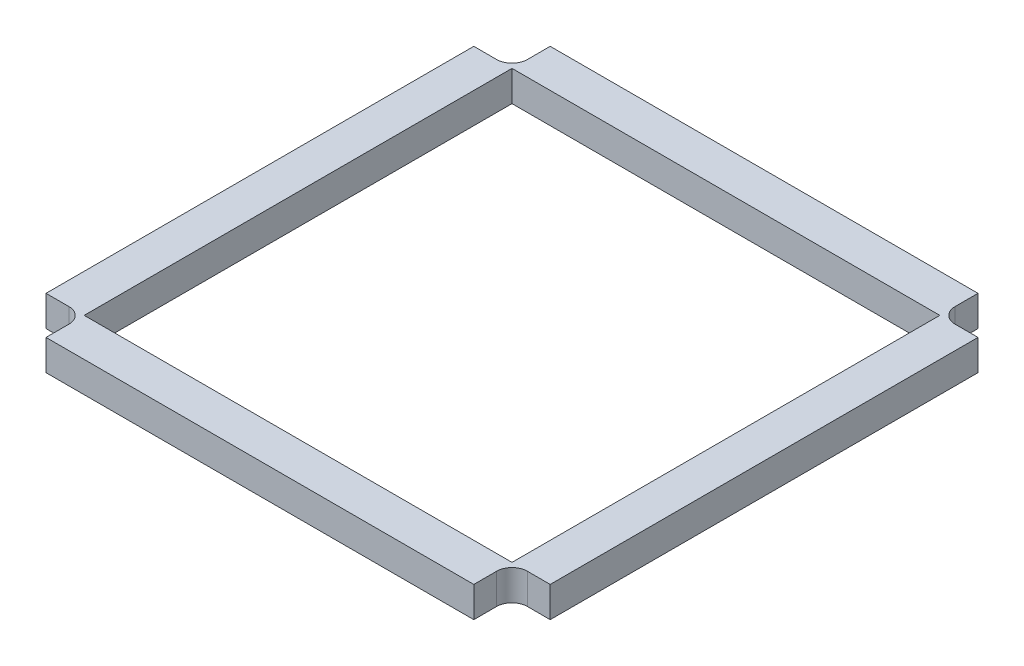
ISO-10303-21;
HEADER;
FILE_DESCRIPTION(('STEP AP214'),'2;1');
FILE_NAME('part.step','',(''),(''),'','','');
FILE_SCHEMA(('AUTOMOTIVE_DESIGN { 1 0 10303 214 1 1 1 1 }'));
ENDSEC;
DATA;
#1=APPLICATION_CONTEXT('core data for automotive mechanical design processes');
#2=APPLICATION_PROTOCOL_DEFINITION('international standard','automotive_design',2000,#1);
#3=PRODUCT_CONTEXT('',#1,'mechanical');
#4=PRODUCT('Part','Part','',(#3));
#5=PRODUCT_RELATED_PRODUCT_CATEGORY('part','',(#4));
#6=PRODUCT_DEFINITION_FORMATION('','',#4);
#7=PRODUCT_DEFINITION_CONTEXT('part definition',#1,'design');
#8=PRODUCT_DEFINITION('design','',#6,#7);
#9=PRODUCT_DEFINITION_SHAPE('','',#8);
#10=(LENGTH_UNIT() NAMED_UNIT(*) SI_UNIT(.MILLI.,.METRE.));
#11=(NAMED_UNIT(*) PLANE_ANGLE_UNIT() SI_UNIT($,.RADIAN.));
#12=(NAMED_UNIT(*) SI_UNIT($,.STERADIAN.) SOLID_ANGLE_UNIT());
#13=UNCERTAINTY_MEASURE_WITH_UNIT(LENGTH_MEASURE(1.E-05),#10,'distance_accuracy_value','');
#14=(GEOMETRIC_REPRESENTATION_CONTEXT(3) GLOBAL_UNCERTAINTY_ASSIGNED_CONTEXT((#13)) GLOBAL_UNIT_ASSIGNED_CONTEXT((#10,
#11,#12)) REPRESENTATION_CONTEXT('',''));
#15=CARTESIAN_POINT('',(0.,0.,0.));
#16=DIRECTION('',(0.,0.,1.));
#17=DIRECTION('',(1.,0.,0.));
#18=AXIS2_PLACEMENT_3D('',#15,#16,#17);
#19=CARTESIAN_POINT('',(0.,10.,0.));
#20=DIRECTION('',(0.,-1.,0.));
#21=DIRECTION('',(0.,0.,-1.));
#22=AXIS2_PLACEMENT_3D('',#19,#20,#21);
#23=PLANE('',#22);
#24=DIRECTION('',(0.,0.,1.));
#25=VECTOR('',#24,1.);
#26=CARTESIAN_POINT('',(0.,10.,0.));
#27=LINE('',#26,#25);
#28=CARTESIAN_POINT('',(0.,10.,-140.));
#29=VERTEX_POINT('',#28);
#30=CARTESIAN_POINT('',(0.,10.,0.));
#31=VERTEX_POINT('',#30);
#32=EDGE_CURVE('E275',#29,#31,#27,.T.);
#33=ORIENTED_EDGE('',*,*,#32,.F.);
#34=DIRECTION('',(-1.,0.,0.));
#35=VECTOR('',#34,1.);
#36=CARTESIAN_POINT('',(0.,10.,-140.));
#37=LINE('',#36,#35);
#38=CARTESIAN_POINT('',(140.,10.,-140.));
#39=VERTEX_POINT('',#38);
#40=EDGE_CURVE('E283',#39,#29,#37,.T.);
#41=ORIENTED_EDGE('',*,*,#40,.F.);
#42=DIRECTION('',(0.,0.,-1.));
#43=VECTOR('',#42,1.);
#44=CARTESIAN_POINT('',(140.,10.,0.));
#45=LINE('',#44,#43);
#46=CARTESIAN_POINT('',(140.,10.,0.));
#47=VERTEX_POINT('',#46);
#48=EDGE_CURVE('E280',#47,#39,#45,.T.);
#49=ORIENTED_EDGE('',*,*,#48,.F.);
#50=DIRECTION('',(1.,0.,0.));
#51=VECTOR('',#50,1.);
#52=CARTESIAN_POINT('',(0.,10.,0.));
#53=LINE('',#52,#51);
#54=EDGE_CURVE('E277',#31,#47,#53,.T.);
#55=ORIENTED_EDGE('',*,*,#54,.F.);
#56=EDGE_LOOP('',(#33,#41,#49,#55));
#57=FACE_BOUND('',#56,.T.);
#58=DIRECTION('',(0.,0.,-1.));
#59=VECTOR('',#58,1.);
#60=CARTESIAN_POINT('',(140.,10.,-145.000000000002));
#61=LINE('',#60,#59);
#62=CARTESIAN_POINT('',(140.,10.,-145.000000000002));
#63=VERTEX_POINT('',#62);
#64=CARTESIAN_POINT('',(140.,10.,-152.500000000002));
#65=VERTEX_POINT('',#64);
#66=EDGE_CURVE('E240',#63,#65,#61,.T.);
#67=ORIENTED_EDGE('',*,*,#66,.T.);
#68=DIRECTION('',(-1.,0.,0.));
#69=VECTOR('',#68,1.);
#70=CARTESIAN_POINT('',(-12.5,10.,-152.5));
#71=LINE('',#70,#69);
#72=CARTESIAN_POINT('',(0.,10.,-152.5));
#73=VERTEX_POINT('',#72);
#74=EDGE_CURVE('E11',#65,#73,#71,.T.);
#75=ORIENTED_EDGE('',*,*,#74,.T.);
#76=DIRECTION('',(0.,0.,-1.));
#77=VECTOR('',#76,1.);
#78=CARTESIAN_POINT('',(0.,10.,-145.));
#79=LINE('',#78,#77);
#80=CARTESIAN_POINT('',(0.,10.,-145.));
#81=VERTEX_POINT('',#80);
#82=EDGE_CURVE('E196',#81,#73,#79,.T.);
#83=ORIENTED_EDGE('',*,*,#82,.F.);
#84=CARTESIAN_POINT('',(-4.99999999999996,10.,-145.));
#85=DIRECTION('',(0.,1.,0.));
#86=DIRECTION('',(0.,0.,1.));
#87=AXIS2_PLACEMENT_3D('',#84,#85,#86);
#88=CIRCLE('',#87,5.);
#89=CARTESIAN_POINT('',(-4.99999999999996,10.,-140.));
#90=VERTEX_POINT('',#89);
#91=EDGE_CURVE('E256',#90,#81,#88,.T.);
#92=ORIENTED_EDGE('',*,*,#91,.F.);
#93=DIRECTION('',(-1.,0.,0.));
#94=VECTOR('',#93,1.);
#95=CARTESIAN_POINT('',(-4.99999999999996,10.,-140.));
#96=LINE('',#95,#94);
#97=CARTESIAN_POINT('',(-12.5,10.,-140.));
#98=VERTEX_POINT('',#97);
#99=EDGE_CURVE('E193',#90,#98,#96,.T.);
#100=ORIENTED_EDGE('',*,*,#99,.T.);
#101=DIRECTION('',(0.,0.,1.));
#102=VECTOR('',#101,1.);
#103=CARTESIAN_POINT('',(-12.5,10.,12.5));
#104=LINE('',#103,#102);
#105=CARTESIAN_POINT('',(-12.4999999999987,10.,-9.17421519602636E-13));
#106=VERTEX_POINT('',#105);
#107=EDGE_CURVE('E306',#98,#106,#104,.T.);
#108=ORIENTED_EDGE('',*,*,#107,.T.);
#109=DIRECTION('',(-1.,0.,0.));
#110=VECTOR('',#109,1.);
#111=CARTESIAN_POINT('',(-4.99999999999867,10.,-8.80416143237298E-13));
#112=LINE('',#111,#110);
#113=CARTESIAN_POINT('',(-4.99999999999867,10.,-8.80416143237298E-13));
#114=VERTEX_POINT('',#113);
#115=EDGE_CURVE('E189',#114,#106,#112,.T.);
#116=ORIENTED_EDGE('',*,*,#115,.F.);
#117=CARTESIAN_POINT('',(-4.99999999999873,10.,4.99999999999912));
#118=DIRECTION('',(0.,1.,0.));
#119=DIRECTION('',(0.,0.,1.));
#120=AXIS2_PLACEMENT_3D('',#117,#118,#119);
#121=CIRCLE('',#120,5.);
#122=CARTESIAN_POINT('',(1.27675647831893E-12,10.,4.99999999999917));
#123=VERTEX_POINT('',#122);
#124=EDGE_CURVE('E176',#123,#114,#121,.T.);
#125=ORIENTED_EDGE('',*,*,#124,.F.);
#126=DIRECTION('',(0.,0.,1.));
#127=VECTOR('',#126,1.);
#128=CARTESIAN_POINT('',(1.27675647831893E-12,10.,4.99999999999917));
#129=LINE('',#128,#127);
#130=CARTESIAN_POINT('',(1.13797860024079E-12,10.,12.4999999999992));
#131=VERTEX_POINT('',#130);
#132=EDGE_CURVE('E184',#123,#131,#129,.T.);
#133=ORIENTED_EDGE('',*,*,#132,.T.);
#134=DIRECTION('',(1.,0.,0.));
#135=VECTOR('',#134,1.);
#136=CARTESIAN_POINT('',(-12.5,10.,12.5));
#137=LINE('',#136,#135);
#138=CARTESIAN_POINT('',(140.,10.,12.5));
#139=VERTEX_POINT('',#138);
#140=EDGE_CURVE('E308',#131,#139,#137,.T.);
#141=ORIENTED_EDGE('',*,*,#140,.T.);
#142=DIRECTION('',(0.,0.,1.));
#143=VECTOR('',#142,1.);
#144=CARTESIAN_POINT('',(140.,10.,4.99999999999995));
#145=LINE('',#144,#143);
#146=CARTESIAN_POINT('',(140.,10.,4.99999999999995));
#147=VERTEX_POINT('',#146);
#148=EDGE_CURVE('E219',#147,#139,#145,.T.);
#149=ORIENTED_EDGE('',*,*,#148,.F.);
#150=CARTESIAN_POINT('',(145.,10.,4.99999999999995));
#151=DIRECTION('',(0.,1.,0.));
#152=DIRECTION('',(0.,0.,1.));
#153=AXIS2_PLACEMENT_3D('',#150,#151,#152);
#154=CIRCLE('',#153,5.);
#155=CARTESIAN_POINT('',(145.,10.,0.));
#156=VERTEX_POINT('',#155);
#157=EDGE_CURVE('E181',#156,#147,#154,.T.);
#158=ORIENTED_EDGE('',*,*,#157,.F.);
#159=DIRECTION('',(1.,0.,0.));
#160=VECTOR('',#159,1.);
#161=CARTESIAN_POINT('',(145.,10.,0.));
#162=LINE('',#161,#160);
#163=CARTESIAN_POINT('',(152.5,10.,0.));
#164=VERTEX_POINT('',#163);
#165=EDGE_CURVE('E216',#156,#164,#162,.T.);
#166=ORIENTED_EDGE('',*,*,#165,.T.);
#167=DIRECTION('',(0.,0.,-1.));
#168=VECTOR('',#167,1.);
#169=CARTESIAN_POINT('',(152.5,10.,12.5));
#170=LINE('',#169,#168);
#171=CARTESIAN_POINT('',(152.5,10.,-140.000000000002));
#172=VERTEX_POINT('',#171);
#173=EDGE_CURVE('E42',#164,#172,#170,.T.);
#174=ORIENTED_EDGE('',*,*,#173,.T.);
#175=DIRECTION('',(1.,0.,0.));
#176=VECTOR('',#175,1.);
#177=CARTESIAN_POINT('',(145.,10.,-140.000000000002));
#178=LINE('',#177,#176);
#179=CARTESIAN_POINT('',(145.,10.,-140.000000000002));
#180=VERTEX_POINT('',#179);
#181=EDGE_CURVE('E242',#180,#172,#178,.T.);
#182=ORIENTED_EDGE('',*,*,#181,.F.);
#183=CARTESIAN_POINT('',(145.,10.,-145.000000000002));
#184=DIRECTION('',(0.,1.,0.));
#185=DIRECTION('',(0.,0.,1.));
#186=AXIS2_PLACEMENT_3D('',#183,#184,#185);
#187=CIRCLE('',#186,5.);
#188=EDGE_CURVE('E215',#63,#180,#187,.T.);
#189=ORIENTED_EDGE('',*,*,#188,.F.);
#190=EDGE_LOOP('',(#67,#75,#83,#92,#100,#108,#116,#125,#133,#141,#149,#158,#166,#174,#182,#189));
#191=FACE_BOUND('',#190,.T.);
#192=ADVANCED_FACE('F33',(#57,#191),#23,.F.);
#193=CARTESIAN_POINT('',(0.,0.,0.));
#194=DIRECTION('',(0.,-1.,0.));
#195=DIRECTION('',(0.,0.,-1.));
#196=AXIS2_PLACEMENT_3D('',#193,#194,#195);
#197=PLANE('',#196);
#198=DIRECTION('',(-1.,0.,0.));
#199=VECTOR('',#198,1.);
#200=CARTESIAN_POINT('',(0.,0.,-140.));
#201=LINE('',#200,#199);
#202=CARTESIAN_POINT('',(140.,0.,-140.));
#203=VERTEX_POINT('',#202);
#204=CARTESIAN_POINT('',(0.,0.,-140.));
#205=VERTEX_POINT('',#204);
#206=EDGE_CURVE('E278',#203,#205,#201,.T.);
#207=ORIENTED_EDGE('',*,*,#206,.T.);
#208=DIRECTION('',(0.,0.,1.));
#209=VECTOR('',#208,1.);
#210=CARTESIAN_POINT('',(0.,0.,0.));
#211=LINE('',#210,#209);
#212=CARTESIAN_POINT('',(0.,0.,0.));
#213=VERTEX_POINT('',#212);
#214=EDGE_CURVE('E274',#205,#213,#211,.T.);
#215=ORIENTED_EDGE('',*,*,#214,.T.);
#216=DIRECTION('',(1.,0.,0.));
#217=VECTOR('',#216,1.);
#218=CARTESIAN_POINT('',(0.,0.,0.));
#219=LINE('',#218,#217);
#220=CARTESIAN_POINT('',(140.,0.,0.));
#221=VERTEX_POINT('',#220);
#222=EDGE_CURVE('E288',#213,#221,#219,.T.);
#223=ORIENTED_EDGE('',*,*,#222,.T.);
#224=DIRECTION('',(0.,0.,-1.));
#225=VECTOR('',#224,1.);
#226=CARTESIAN_POINT('',(140.,0.,0.));
#227=LINE('',#226,#225);
#228=EDGE_CURVE('E291',#221,#203,#227,.T.);
#229=ORIENTED_EDGE('',*,*,#228,.T.);
#230=EDGE_LOOP('',(#207,#215,#223,#229));
#231=FACE_BOUND('',#230,.T.);
#232=DIRECTION('',(-1.,0.,0.));
#233=VECTOR('',#232,1.);
#234=CARTESIAN_POINT('',(-12.5,0.,-152.5));
#235=LINE('',#234,#233);
#236=CARTESIAN_POINT('',(140.,0.,-152.5));
#237=VERTEX_POINT('',#236);
#238=CARTESIAN_POINT('',(0.,0.,-152.5));
#239=VERTEX_POINT('',#238);
#240=EDGE_CURVE('E37',#237,#239,#235,.T.);
#241=ORIENTED_EDGE('',*,*,#240,.F.);
#242=DIRECTION('',(0.,0.,-1.));
#243=VECTOR('',#242,1.);
#244=CARTESIAN_POINT('',(140.,0.,-145.000000000002));
#245=LINE('',#244,#243);
#246=CARTESIAN_POINT('',(140.,0.,-145.000000000002));
#247=VERTEX_POINT('',#246);
#248=EDGE_CURVE('E232',#247,#237,#245,.T.);
#249=ORIENTED_EDGE('',*,*,#248,.F.);
#250=CARTESIAN_POINT('',(145.,0.,-145.000000000002));
#251=DIRECTION('',(0.,1.,0.));
#252=DIRECTION('',(0.,0.,1.));
#253=AXIS2_PLACEMENT_3D('',#250,#251,#252);
#254=CIRCLE('',#253,5.);
#255=CARTESIAN_POINT('',(145.,0.,-140.000000000002));
#256=VERTEX_POINT('',#255);
#257=EDGE_CURVE('E243',#247,#256,#254,.T.);
#258=ORIENTED_EDGE('',*,*,#257,.T.);
#259=DIRECTION('',(1.,0.,0.));
#260=VECTOR('',#259,1.);
#261=CARTESIAN_POINT('',(145.,0.,-140.000000000002));
#262=LINE('',#261,#260);
#263=CARTESIAN_POINT('',(152.5,0.,-140.000000000002));
#264=VERTEX_POINT('',#263);
#265=EDGE_CURVE('E248',#256,#264,#262,.T.);
#266=ORIENTED_EDGE('',*,*,#265,.T.);
#267=DIRECTION('',(0.,0.,-1.));
#268=VECTOR('',#267,1.);
#269=CARTESIAN_POINT('',(152.5,0.,12.5));
#270=LINE('',#269,#268);
#271=CARTESIAN_POINT('',(152.5,0.,0.));
#272=VERTEX_POINT('',#271);
#273=EDGE_CURVE('E316',#272,#264,#270,.T.);
#274=ORIENTED_EDGE('',*,*,#273,.F.);
#275=DIRECTION('',(1.,0.,0.));
#276=VECTOR('',#275,1.);
#277=CARTESIAN_POINT('',(145.,0.,0.));
#278=LINE('',#277,#276);
#279=CARTESIAN_POINT('',(145.,0.,0.));
#280=VERTEX_POINT('',#279);
#281=EDGE_CURVE('E58',#280,#272,#278,.T.);
#282=ORIENTED_EDGE('',*,*,#281,.F.);
#283=CARTESIAN_POINT('',(145.,0.,4.99999999999995));
#284=DIRECTION('',(0.,1.,0.));
#285=DIRECTION('',(0.,0.,1.));
#286=AXIS2_PLACEMENT_3D('',#283,#284,#285);
#287=CIRCLE('',#286,5.);
#288=CARTESIAN_POINT('',(140.,0.,4.99999999999995));
#289=VERTEX_POINT('',#288);
#290=EDGE_CURVE('E220',#280,#289,#287,.T.);
#291=ORIENTED_EDGE('',*,*,#290,.T.);
#292=DIRECTION('',(0.,0.,1.));
#293=VECTOR('',#292,1.);
#294=CARTESIAN_POINT('',(140.,0.,4.99999999999995));
#295=LINE('',#294,#293);
#296=CARTESIAN_POINT('',(140.,0.,12.5));
#297=VERTEX_POINT('',#296);
#298=EDGE_CURVE('E225',#289,#297,#295,.T.);
#299=ORIENTED_EDGE('',*,*,#298,.T.);
#300=DIRECTION('',(1.,0.,0.));
#301=VECTOR('',#300,1.);
#302=CARTESIAN_POINT('',(-12.5,0.,12.5));
#303=LINE('',#302,#301);
#304=CARTESIAN_POINT('',(1.27675647831893E-12,0.,12.5));
#305=VERTEX_POINT('',#304);
#306=EDGE_CURVE('E314',#305,#297,#303,.T.);
#307=ORIENTED_EDGE('',*,*,#306,.F.);
#308=DIRECTION('',(0.,0.,1.));
#309=VECTOR('',#308,1.);
#310=CARTESIAN_POINT('',(1.27675647831893E-12,0.,4.99999999999917));
#311=LINE('',#310,#309);
#312=CARTESIAN_POINT('',(1.27675647831893E-12,0.,4.99999999999917));
#313=VERTEX_POINT('',#312);
#314=EDGE_CURVE('E50',#313,#305,#311,.T.);
#315=ORIENTED_EDGE('',*,*,#314,.F.);
#316=CARTESIAN_POINT('',(-4.99999999999873,0.,4.99999999999912));
#317=DIRECTION('',(0.,1.,0.));
#318=DIRECTION('',(0.,0.,1.));
#319=AXIS2_PLACEMENT_3D('',#316,#317,#318);
#320=CIRCLE('',#319,5.);
#321=CARTESIAN_POINT('',(-4.99999999999867,0.,-8.80416143237298E-13));
#322=VERTEX_POINT('',#321);
#323=EDGE_CURVE('E179',#313,#322,#320,.T.);
#324=ORIENTED_EDGE('',*,*,#323,.T.);
#325=DIRECTION('',(-1.,0.,0.));
#326=VECTOR('',#325,1.);
#327=CARTESIAN_POINT('',(-4.99999999999867,0.,-8.80416143237298E-13));
#328=LINE('',#327,#326);
#329=CARTESIAN_POINT('',(-12.4999999999987,0.,-9.17421519602636E-13));
#330=VERTEX_POINT('',#329);
#331=EDGE_CURVE('E201',#322,#330,#328,.T.);
#332=ORIENTED_EDGE('',*,*,#331,.T.);
#333=DIRECTION('',(0.,0.,1.));
#334=VECTOR('',#333,1.);
#335=CARTESIAN_POINT('',(-12.5,0.,12.5));
#336=LINE('',#335,#334);
#337=CARTESIAN_POINT('',(-12.5,0.,-140.));
#338=VERTEX_POINT('',#337);
#339=EDGE_CURVE('E305',#338,#330,#336,.T.);
#340=ORIENTED_EDGE('',*,*,#339,.F.);
#341=DIRECTION('',(-1.,0.,0.));
#342=VECTOR('',#341,1.);
#343=CARTESIAN_POINT('',(-4.99999999999996,0.,-140.));
#344=LINE('',#343,#342);
#345=CARTESIAN_POINT('',(-4.99999999999996,0.,-140.));
#346=VERTEX_POINT('',#345);
#347=EDGE_CURVE('E253',#346,#338,#344,.T.);
#348=ORIENTED_EDGE('',*,*,#347,.F.);
#349=CARTESIAN_POINT('',(-4.99999999999996,0.,-145.));
#350=DIRECTION('',(0.,1.,0.));
#351=DIRECTION('',(0.,0.,1.));
#352=AXIS2_PLACEMENT_3D('',#349,#350,#351);
#353=CIRCLE('',#352,5.);
#354=CARTESIAN_POINT('',(0.,0.,-145.));
#355=VERTEX_POINT('',#354);
#356=EDGE_CURVE('E259',#346,#355,#353,.T.);
#357=ORIENTED_EDGE('',*,*,#356,.T.);
#358=DIRECTION('',(0.,0.,-1.));
#359=VECTOR('',#358,1.);
#360=CARTESIAN_POINT('',(0.,0.,-145.));
#361=LINE('',#360,#359);
#362=EDGE_CURVE('E255',#355,#239,#361,.T.);
#363=ORIENTED_EDGE('',*,*,#362,.T.);
#364=EDGE_LOOP('',(#241,#249,#258,#266,#274,#282,#291,#299,#307,#315,#324,#332,#340,#348,#357,#363));
#365=FACE_BOUND('',#364,.T.);
#366=ADVANCED_FACE('F328',(#231,#365),#197,.T.);
#367=CARTESIAN_POINT('',(-12.5,10.,12.5));
#368=DIRECTION('',(1.,0.,0.));
#369=DIRECTION('',(0.,0.,-1.));
#370=AXIS2_PLACEMENT_3D('',#367,#368,#369);
#371=PLANE('',#370);
#372=ORIENTED_EDGE('',*,*,#339,.T.);
#373=DIRECTION('',(0.,1.,0.));
#374=VECTOR('',#373,1.);
#375=CARTESIAN_POINT('',(-12.4999999999987,0.,-9.17421519602636E-13));
#376=LINE('',#375,#374);
#377=EDGE_CURVE('E361',#330,#106,#376,.T.);
#378=ORIENTED_EDGE('',*,*,#377,.T.);
#379=ORIENTED_EDGE('',*,*,#107,.F.);
#380=DIRECTION('',(0.,1.,0.));
#381=VECTOR('',#380,1.);
#382=CARTESIAN_POINT('',(-12.5,0.,-140.));
#383=LINE('',#382,#381);
#384=EDGE_CURVE('E272',#338,#98,#383,.T.);
#385=ORIENTED_EDGE('',*,*,#384,.F.);
#386=EDGE_LOOP('',(#372,#378,#379,#385));
#387=FACE_BOUND('',#386,.T.);
#388=ADVANCED_FACE('F35',(#387),#371,.F.);
#389=CARTESIAN_POINT('',(-12.5,10.,12.5));
#390=DIRECTION('',(0.,0.,-1.));
#391=DIRECTION('',(-1.,0.,0.));
#392=AXIS2_PLACEMENT_3D('',#389,#390,#391);
#393=PLANE('',#392);
#394=ORIENTED_EDGE('',*,*,#306,.T.);
#395=DIRECTION('',(0.,1.,0.));
#396=VECTOR('',#395,1.);
#397=CARTESIAN_POINT('',(140.,0.,12.5));
#398=LINE('',#397,#396);
#399=EDGE_CURVE('E208',#297,#139,#398,.T.);
#400=ORIENTED_EDGE('',*,*,#399,.T.);
#401=ORIENTED_EDGE('',*,*,#140,.F.);
#402=DIRECTION('',(0.,1.,0.));
#403=VECTOR('',#402,1.);
#404=CARTESIAN_POINT('',(1.13797860024079E-12,0.,12.4999999999992));
#405=LINE('',#404,#403);
#406=EDGE_CURVE('E180',#305,#131,#405,.T.);
#407=ORIENTED_EDGE('',*,*,#406,.F.);
#408=EDGE_LOOP('',(#394,#400,#401,#407));
#409=FACE_BOUND('',#408,.T.);
#410=ADVANCED_FACE('F360',(#409),#393,.F.);
#411=CARTESIAN_POINT('',(152.5,10.,12.5));
#412=DIRECTION('',(-1.,0.,0.));
#413=DIRECTION('',(0.,0.,1.));
#414=AXIS2_PLACEMENT_3D('',#411,#412,#413);
#415=PLANE('',#414);
#416=ORIENTED_EDGE('',*,*,#273,.T.);
#417=DIRECTION('',(0.,1.,0.));
#418=VECTOR('',#417,1.);
#419=CARTESIAN_POINT('',(152.5,0.,-140.000000000002));
#420=LINE('',#419,#418);
#421=EDGE_CURVE('E233',#264,#172,#420,.T.);
#422=ORIENTED_EDGE('',*,*,#421,.T.);
#423=ORIENTED_EDGE('',*,*,#173,.F.);
#424=DIRECTION('',(0.,1.,0.));
#425=VECTOR('',#424,1.);
#426=CARTESIAN_POINT('',(152.5,0.,0.));
#427=LINE('',#426,#425);
#428=EDGE_CURVE('E211',#272,#164,#427,.T.);
#429=ORIENTED_EDGE('',*,*,#428,.F.);
#430=EDGE_LOOP('',(#416,#422,#423,#429));
#431=FACE_BOUND('',#430,.T.);
#432=ADVANCED_FACE('F348',(#431),#415,.F.);
#433=CARTESIAN_POINT('',(-12.5,10.,-152.5));
#434=DIRECTION('',(0.,0.,1.));
#435=DIRECTION('',(1.,0.,0.));
#436=AXIS2_PLACEMENT_3D('',#433,#434,#435);
#437=PLANE('',#436);
#438=DIRECTION('',(0.,1.,0.));
#439=VECTOR('',#438,1.);
#440=CARTESIAN_POINT('',(140.,0.,-152.500000000002));
#441=LINE('',#440,#439);
#442=EDGE_CURVE('E236',#237,#65,#441,.T.);
#443=ORIENTED_EDGE('',*,*,#442,.F.);
#444=ORIENTED_EDGE('',*,*,#240,.T.);
#445=DIRECTION('',(0.,1.,0.));
#446=VECTOR('',#445,1.);
#447=CARTESIAN_POINT('',(0.,0.,-152.5));
#448=LINE('',#447,#446);
#449=EDGE_CURVE('E269',#239,#73,#448,.T.);
#450=ORIENTED_EDGE('',*,*,#449,.T.);
#451=ORIENTED_EDGE('',*,*,#74,.F.);
#452=EDGE_LOOP('',(#443,#444,#450,#451));
#453=FACE_BOUND('',#452,.T.);
#454=ADVANCED_FACE('F324',(#453),#437,.F.);
#455=CARTESIAN_POINT('',(0.,10.,0.));
#456=DIRECTION('',(1.,0.,0.));
#457=DIRECTION('',(0.,0.,-1.));
#458=AXIS2_PLACEMENT_3D('',#455,#456,#457);
#459=PLANE('',#458);
#460=ORIENTED_EDGE('',*,*,#214,.F.);
#461=DIRECTION('',(0.,-1.,0.));
#462=VECTOR('',#461,1.);
#463=CARTESIAN_POINT('',(0.,10.,-140.));
#464=LINE('',#463,#462);
#465=EDGE_CURVE('E285',#29,#205,#464,.T.);
#466=ORIENTED_EDGE('',*,*,#465,.F.);
#467=ORIENTED_EDGE('',*,*,#32,.T.);
#468=DIRECTION('',(0.,-1.,0.));
#469=VECTOR('',#468,1.);
#470=CARTESIAN_POINT('',(0.,10.,0.));
#471=LINE('',#470,#469);
#472=EDGE_CURVE('E302',#31,#213,#471,.T.);
#473=ORIENTED_EDGE('',*,*,#472,.T.);
#474=EDGE_LOOP('',(#460,#466,#467,#473));
#475=FACE_BOUND('',#474,.T.);
#476=ADVANCED_FACE('F397',(#475),#459,.T.);
#477=CARTESIAN_POINT('',(0.,10.,0.));
#478=DIRECTION('',(0.,0.,-1.));
#479=DIRECTION('',(-1.,0.,0.));
#480=AXIS2_PLACEMENT_3D('',#477,#478,#479);
#481=PLANE('',#480);
#482=ORIENTED_EDGE('',*,*,#222,.F.);
#483=ORIENTED_EDGE('',*,*,#472,.F.);
#484=ORIENTED_EDGE('',*,*,#54,.T.);
#485=DIRECTION('',(0.,-1.,0.));
#486=VECTOR('',#485,1.);
#487=CARTESIAN_POINT('',(140.,10.,0.));
#488=LINE('',#487,#486);
#489=EDGE_CURVE('E300',#47,#221,#488,.T.);
#490=ORIENTED_EDGE('',*,*,#489,.T.);
#491=EDGE_LOOP('',(#482,#483,#484,#490));
#492=FACE_BOUND('',#491,.T.);
#493=ADVANCED_FACE('F440',(#492),#481,.T.);
#494=CARTESIAN_POINT('',(140.,10.,0.));
#495=DIRECTION('',(-1.,0.,0.));
#496=DIRECTION('',(0.,0.,1.));
#497=AXIS2_PLACEMENT_3D('',#494,#495,#496);
#498=PLANE('',#497);
#499=ORIENTED_EDGE('',*,*,#228,.F.);
#500=ORIENTED_EDGE('',*,*,#489,.F.);
#501=ORIENTED_EDGE('',*,*,#48,.T.);
#502=DIRECTION('',(0.,-1.,0.));
#503=VECTOR('',#502,1.);
#504=CARTESIAN_POINT('',(140.,10.,-140.));
#505=LINE('',#504,#503);
#506=EDGE_CURVE('E298',#39,#203,#505,.T.);
#507=ORIENTED_EDGE('',*,*,#506,.T.);
#508=EDGE_LOOP('',(#499,#500,#501,#507));
#509=FACE_BOUND('',#508,.T.);
#510=ADVANCED_FACE('F428',(#509),#498,.T.);
#511=CARTESIAN_POINT('',(0.,10.,-140.));
#512=DIRECTION('',(0.,0.,1.));
#513=DIRECTION('',(1.,0.,0.));
#514=AXIS2_PLACEMENT_3D('',#511,#512,#513);
#515=PLANE('',#514);
#516=ORIENTED_EDGE('',*,*,#206,.F.);
#517=ORIENTED_EDGE('',*,*,#506,.F.);
#518=ORIENTED_EDGE('',*,*,#40,.T.);
#519=ORIENTED_EDGE('',*,*,#465,.T.);
#520=EDGE_LOOP('',(#516,#517,#518,#519));
#521=FACE_BOUND('',#520,.T.);
#522=ADVANCED_FACE('F423',(#521),#515,.T.);
#523=CARTESIAN_POINT('',(-4.99999999999996,0.,-140.));
#524=DIRECTION('',(0.,0.,-1.));
#525=DIRECTION('',(-1.,0.,0.));
#526=AXIS2_PLACEMENT_3D('',#523,#524,#525);
#527=PLANE('',#526);
#528=ORIENTED_EDGE('',*,*,#99,.F.);
#529=DIRECTION('',(0.,1.,0.));
#530=VECTOR('',#529,1.);
#531=CARTESIAN_POINT('',(-4.99999999999996,0.,-140.));
#532=LINE('',#531,#530);
#533=EDGE_CURVE('E261',#346,#90,#532,.T.);
#534=ORIENTED_EDGE('',*,*,#533,.F.);
#535=ORIENTED_EDGE('',*,*,#347,.T.);
#536=ORIENTED_EDGE('',*,*,#384,.T.);
#537=EDGE_LOOP('',(#528,#534,#535,#536));
#538=FACE_BOUND('',#537,.T.);
#539=ADVANCED_FACE('F375',(#538),#527,.T.);
#540=CARTESIAN_POINT('',(0.,0.,-145.));
#541=DIRECTION('',(1.,0.,0.));
#542=DIRECTION('',(0.,0.,-1.));
#543=AXIS2_PLACEMENT_3D('',#540,#541,#542);
#544=PLANE('',#543);
#545=ORIENTED_EDGE('',*,*,#82,.T.);
#546=ORIENTED_EDGE('',*,*,#449,.F.);
#547=ORIENTED_EDGE('',*,*,#362,.F.);
#548=DIRECTION('',(0.,1.,0.));
#549=VECTOR('',#548,1.);
#550=CARTESIAN_POINT('',(0.,0.,-145.));
#551=LINE('',#550,#549);
#552=EDGE_CURVE('E267',#355,#81,#551,.T.);
#553=ORIENTED_EDGE('',*,*,#552,.T.);
#554=EDGE_LOOP('',(#545,#546,#547,#553));
#555=FACE_BOUND('',#554,.T.);
#556=ADVANCED_FACE('F333',(#555),#544,.F.);
#557=CARTESIAN_POINT('',(-4.99999999999996,0.,-145.));
#558=DIRECTION('',(0.,1.,0.));
#559=DIRECTION('',(0.,0.,1.));
#560=AXIS2_PLACEMENT_3D('',#557,#558,#559);
#561=CYLINDRICAL_SURFACE('',#560,5.);
#562=ORIENTED_EDGE('',*,*,#91,.T.);
#563=ORIENTED_EDGE('',*,*,#552,.F.);
#564=ORIENTED_EDGE('',*,*,#356,.F.);
#565=ORIENTED_EDGE('',*,*,#533,.T.);
#566=EDGE_LOOP('',(#562,#563,#564,#565));
#567=FACE_BOUND('',#566,.T.);
#568=ADVANCED_FACE('F377',(#567),#561,.F.);
#569=CARTESIAN_POINT('',(145.,0.,-145.000000000002));
#570=DIRECTION('',(0.,1.,0.));
#571=DIRECTION('',(0.,0.,1.));
#572=AXIS2_PLACEMENT_3D('',#569,#570,#571);
#573=CYLINDRICAL_SURFACE('',#572,5.);
#574=ORIENTED_EDGE('',*,*,#188,.T.);
#575=DIRECTION('',(0.,1.,0.));
#576=VECTOR('',#575,1.);
#577=CARTESIAN_POINT('',(145.,0.,-140.000000000002));
#578=LINE('',#577,#576);
#579=EDGE_CURVE('E230',#256,#180,#578,.T.);
#580=ORIENTED_EDGE('',*,*,#579,.F.);
#581=ORIENTED_EDGE('',*,*,#257,.F.);
#582=DIRECTION('',(0.,1.,0.));
#583=VECTOR('',#582,1.);
#584=CARTESIAN_POINT('',(140.,0.,-145.000000000002));
#585=LINE('',#584,#583);
#586=EDGE_CURVE('E238',#247,#63,#585,.T.);
#587=ORIENTED_EDGE('',*,*,#586,.T.);
#588=EDGE_LOOP('',(#574,#580,#581,#587));
#589=FACE_BOUND('',#588,.T.);
#590=ADVANCED_FACE('F343',(#589),#573,.F.);
#591=CARTESIAN_POINT('',(140.,0.,-145.000000000002));
#592=DIRECTION('',(1.,0.,0.));
#593=DIRECTION('',(0.,0.,-1.));
#594=AXIS2_PLACEMENT_3D('',#591,#592,#593);
#595=PLANE('',#594);
#596=ORIENTED_EDGE('',*,*,#66,.F.);
#597=ORIENTED_EDGE('',*,*,#586,.F.);
#598=ORIENTED_EDGE('',*,*,#248,.T.);
#599=ORIENTED_EDGE('',*,*,#442,.T.);
#600=EDGE_LOOP('',(#596,#597,#598,#599));
#601=FACE_BOUND('',#600,.T.);
#602=ADVANCED_FACE('F340',(#601),#595,.T.);
#603=CARTESIAN_POINT('',(145.,0.,-140.000000000002));
#604=DIRECTION('',(0.,0.,1.));
#605=DIRECTION('',(1.,0.,0.));
#606=AXIS2_PLACEMENT_3D('',#603,#604,#605);
#607=PLANE('',#606);
#608=ORIENTED_EDGE('',*,*,#181,.T.);
#609=ORIENTED_EDGE('',*,*,#421,.F.);
#610=ORIENTED_EDGE('',*,*,#265,.F.);
#611=ORIENTED_EDGE('',*,*,#579,.T.);
#612=EDGE_LOOP('',(#608,#609,#610,#611));
#613=FACE_BOUND('',#612,.T.);
#614=ADVANCED_FACE('F346',(#613),#607,.F.);
#615=CARTESIAN_POINT('',(145.,0.,4.99999999999995));
#616=DIRECTION('',(0.,1.,0.));
#617=DIRECTION('',(0.,0.,1.));
#618=AXIS2_PLACEMENT_3D('',#615,#616,#617);
#619=CYLINDRICAL_SURFACE('',#618,5.);
#620=ORIENTED_EDGE('',*,*,#157,.T.);
#621=DIRECTION('',(0.,1.,0.));
#622=VECTOR('',#621,1.);
#623=CARTESIAN_POINT('',(140.,0.,4.99999999999995));
#624=LINE('',#623,#622);
#625=EDGE_CURVE('E206',#289,#147,#624,.T.);
#626=ORIENTED_EDGE('',*,*,#625,.F.);
#627=ORIENTED_EDGE('',*,*,#290,.F.);
#628=DIRECTION('',(0.,1.,0.));
#629=VECTOR('',#628,1.);
#630=CARTESIAN_POINT('',(145.,0.,0.));
#631=LINE('',#630,#629);
#632=EDGE_CURVE('E213',#280,#156,#631,.T.);
#633=ORIENTED_EDGE('',*,*,#632,.T.);
#634=EDGE_LOOP('',(#620,#626,#627,#633));
#635=FACE_BOUND('',#634,.T.);
#636=ADVANCED_FACE('F355',(#635),#619,.F.);
#637=CARTESIAN_POINT('',(145.,0.,0.));
#638=DIRECTION('',(0.,0.,1.));
#639=DIRECTION('',(1.,0.,0.));
#640=AXIS2_PLACEMENT_3D('',#637,#638,#639);
#641=PLANE('',#640);
#642=ORIENTED_EDGE('',*,*,#165,.F.);
#643=ORIENTED_EDGE('',*,*,#632,.F.);
#644=ORIENTED_EDGE('',*,*,#281,.T.);
#645=ORIENTED_EDGE('',*,*,#428,.T.);
#646=EDGE_LOOP('',(#642,#643,#644,#645));
#647=FACE_BOUND('',#646,.T.);
#648=ADVANCED_FACE('F352',(#647),#641,.T.);
#649=CARTESIAN_POINT('',(140.,0.,4.99999999999995));
#650=DIRECTION('',(-1.,0.,0.));
#651=DIRECTION('',(0.,0.,1.));
#652=AXIS2_PLACEMENT_3D('',#649,#650,#651);
#653=PLANE('',#652);
#654=ORIENTED_EDGE('',*,*,#148,.T.);
#655=ORIENTED_EDGE('',*,*,#399,.F.);
#656=ORIENTED_EDGE('',*,*,#298,.F.);
#657=ORIENTED_EDGE('',*,*,#625,.T.);
#658=EDGE_LOOP('',(#654,#655,#656,#657));
#659=FACE_BOUND('',#658,.T.);
#660=ADVANCED_FACE('F528',(#659),#653,.F.);
#661=CARTESIAN_POINT('',(-4.99999999999873,0.,4.99999999999912));
#662=DIRECTION('',(0.,1.,0.));
#663=DIRECTION('',(0.,0.,1.));
#664=AXIS2_PLACEMENT_3D('',#661,#662,#663);
#665=CYLINDRICAL_SURFACE('',#664,5.);
#666=ORIENTED_EDGE('',*,*,#124,.T.);
#667=DIRECTION('',(0.,1.,0.));
#668=VECTOR('',#667,1.);
#669=CARTESIAN_POINT('',(-4.99999999999867,0.,-8.80416143237298E-13));
#670=LINE('',#669,#668);
#671=EDGE_CURVE('E202',#322,#114,#670,.T.);
#672=ORIENTED_EDGE('',*,*,#671,.F.);
#673=ORIENTED_EDGE('',*,*,#323,.F.);
#674=DIRECTION('',(0.,1.,0.));
#675=VECTOR('',#674,1.);
#676=CARTESIAN_POINT('',(1.27675647831893E-12,0.,4.99999999999917));
#677=LINE('',#676,#675);
#678=EDGE_CURVE('E172',#313,#123,#677,.T.);
#679=ORIENTED_EDGE('',*,*,#678,.T.);
#680=EDGE_LOOP('',(#666,#672,#673,#679));
#681=FACE_BOUND('',#680,.T.);
#682=ADVANCED_FACE('F174',(#681),#665,.F.);
#683=CARTESIAN_POINT('',(1.27675647831893E-12,0.,4.99999999999917));
#684=DIRECTION('',(-1.,0.,0.));
#685=DIRECTION('',(0.,0.,1.));
#686=AXIS2_PLACEMENT_3D('',#683,#684,#685);
#687=PLANE('',#686);
#688=ORIENTED_EDGE('',*,*,#132,.F.);
#689=ORIENTED_EDGE('',*,*,#678,.F.);
#690=ORIENTED_EDGE('',*,*,#314,.T.);
#691=ORIENTED_EDGE('',*,*,#406,.T.);
#692=EDGE_LOOP('',(#688,#689,#690,#691));
#693=FACE_BOUND('',#692,.T.);
#694=ADVANCED_FACE('F185',(#693),#687,.T.);
#695=CARTESIAN_POINT('',(-4.99999999999867,0.,-8.80416143237298E-13));
#696=DIRECTION('',(0.,0.,-1.));
#697=DIRECTION('',(-1.,0.,0.));
#698=AXIS2_PLACEMENT_3D('',#695,#696,#697);
#699=PLANE('',#698);
#700=ORIENTED_EDGE('',*,*,#115,.T.);
#701=ORIENTED_EDGE('',*,*,#377,.F.);
#702=ORIENTED_EDGE('',*,*,#331,.F.);
#703=ORIENTED_EDGE('',*,*,#671,.T.);
#704=EDGE_LOOP('',(#700,#701,#702,#703));
#705=FACE_BOUND('',#704,.T.);
#706=ADVANCED_FACE('F368',(#705),#699,.F.);
#707=CLOSED_SHELL('',(#192,#366,#388,#410,#432,#454,#476,#493,#510,#522,#539,#556,#568,#590,
#602,#614,#636,#648,#660,#682,#694,#706));
#708=MANIFOLD_SOLID_BREP('B2',#707);
#709=ADVANCED_BREP_SHAPE_REPRESENTATION('',(#18,#708),#14);
#710=SHAPE_DEFINITION_REPRESENTATION(#9,#709);
ENDSEC;
END-ISO-10303-21;
